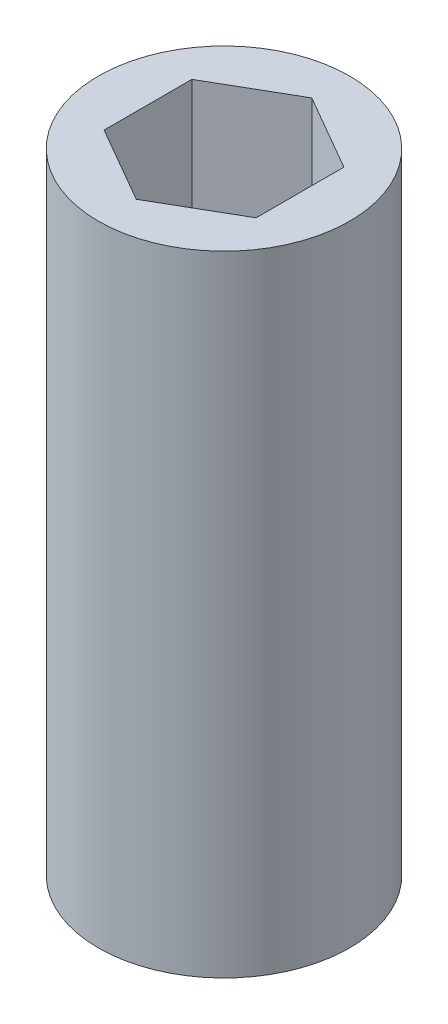
ISO-10303-21;
HEADER;
FILE_DESCRIPTION(('STEP AP214'),'2;1');
FILE_NAME('part.step','',(''),(''),'','','');
FILE_SCHEMA(('AUTOMOTIVE_DESIGN { 1 0 10303 214 1 1 1 1 }'));
ENDSEC;
DATA;
#1=APPLICATION_CONTEXT('core data for automotive mechanical design processes');
#2=APPLICATION_PROTOCOL_DEFINITION('international standard','automotive_design',2000,#1);
#3=PRODUCT_CONTEXT('',#1,'mechanical');
#4=PRODUCT('Part','Part','',(#3));
#5=PRODUCT_RELATED_PRODUCT_CATEGORY('part','',(#4));
#6=PRODUCT_DEFINITION_FORMATION('','',#4);
#7=PRODUCT_DEFINITION_CONTEXT('part definition',#1,'design');
#8=PRODUCT_DEFINITION('design','',#6,#7);
#9=PRODUCT_DEFINITION_SHAPE('','',#8);
#10=(LENGTH_UNIT() NAMED_UNIT(*) SI_UNIT(.MILLI.,.METRE.));
#11=(NAMED_UNIT(*) PLANE_ANGLE_UNIT() SI_UNIT($,.RADIAN.));
#12=(NAMED_UNIT(*) SI_UNIT($,.STERADIAN.) SOLID_ANGLE_UNIT());
#13=UNCERTAINTY_MEASURE_WITH_UNIT(LENGTH_MEASURE(1.E-05),#10,'distance_accuracy_value','');
#14=(GEOMETRIC_REPRESENTATION_CONTEXT(3) GLOBAL_UNCERTAINTY_ASSIGNED_CONTEXT((#13)) GLOBAL_UNIT_ASSIGNED_CONTEXT((#10,
#11,#12)) REPRESENTATION_CONTEXT('',''));
#15=CARTESIAN_POINT('',(0.,0.,0.));
#16=DIRECTION('',(0.,0.,1.));
#17=DIRECTION('',(1.,0.,0.));
#18=AXIS2_PLACEMENT_3D('',#15,#16,#17);
#19=CARTESIAN_POINT('',(0.,39.751,0.));
#20=DIRECTION('',(0.,1.,0.));
#21=DIRECTION('',(0.,0.,1.));
#22=AXIS2_PLACEMENT_3D('',#19,#20,#21);
#23=PLANE('',#22);
#24=CARTESIAN_POINT('',(0.,39.751,0.));
#25=DIRECTION('',(0.,1.,0.));
#26=DIRECTION('',(0.,0.,1.));
#27=AXIS2_PLACEMENT_3D('',#24,#25,#26);
#28=CIRCLE('',#27,7.9375);
#29=CARTESIAN_POINT('',(0.,39.751,7.9375));
#30=VERTEX_POINT('',#29);
#31=EDGE_CURVE('E11',#30,#30,#28,.T.);
#32=ORIENTED_EDGE('',*,*,#31,.T.);
#33=EDGE_LOOP('',(#32));
#34=FACE_BOUND('',#33,.T.);
#35=DIRECTION('',(-0.866025403784438,0.,0.500000000000001));
#36=VECTOR('',#35,1.);
#37=CARTESIAN_POINT('',(0.,39.751,-5.54325540454343));
#38=LINE('',#37,#36);
#39=CARTESIAN_POINT('',(0.,39.751,-5.54325540454343));
#40=VERTEX_POINT('',#39);
#41=CARTESIAN_POINT('',(-4.8006,39.751,-2.7716277022717));
#42=VERTEX_POINT('',#41);
#43=EDGE_CURVE('E97',#40,#42,#38,.T.);
#44=ORIENTED_EDGE('',*,*,#43,.F.);
#45=DIRECTION('',(-0.866025403784441,0.,-0.499999999999995));
#46=VECTOR('',#45,1.);
#47=CARTESIAN_POINT('',(4.80059999999996,39.751,-2.77162770227177));
#48=LINE('',#47,#46);
#49=CARTESIAN_POINT('',(4.80059999999996,39.751,-2.77162770227177));
#50=VERTEX_POINT('',#49);
#51=EDGE_CURVE('E89',#50,#40,#48,.T.);
#52=ORIENTED_EDGE('',*,*,#51,.F.);
#53=DIRECTION('',(0.,0.,-1.));
#54=VECTOR('',#53,1.);
#55=CARTESIAN_POINT('',(4.80060000000002,39.751,2.77162770227167));
#56=LINE('',#55,#54);
#57=CARTESIAN_POINT('',(4.80060000000002,39.751,2.77162770227167));
#58=VERTEX_POINT('',#57);
#59=EDGE_CURVE('E117',#58,#50,#56,.T.);
#60=ORIENTED_EDGE('',*,*,#59,.F.);
#61=DIRECTION('',(0.866025403784434,0.,-0.500000000000007));
#62=VECTOR('',#61,1.);
#63=CARTESIAN_POINT('',(0.,39.751,5.54325540454343));
#64=LINE('',#63,#62);
#65=CARTESIAN_POINT('',(0.,39.751,5.54325540454343));
#66=VERTEX_POINT('',#65);
#67=EDGE_CURVE('E115',#66,#58,#64,.T.);
#68=ORIENTED_EDGE('',*,*,#67,.F.);
#69=DIRECTION('',(0.866025403784442,0.,0.499999999999995));
#70=VECTOR('',#69,1.);
#71=CARTESIAN_POINT('',(-4.80059999999998,39.751,2.77162770227174));
#72=LINE('',#71,#70);
#73=CARTESIAN_POINT('',(-4.80059999999998,39.751,2.77162770227174));
#74=VERTEX_POINT('',#73);
#75=EDGE_CURVE('E111',#74,#66,#72,.T.);
#76=ORIENTED_EDGE('',*,*,#75,.F.);
#77=DIRECTION('',(0.,0.,1.));
#78=VECTOR('',#77,1.);
#79=CARTESIAN_POINT('',(-4.8006,39.751,-2.7716277022717));
#80=LINE('',#79,#78);
#81=EDGE_CURVE('E109',#42,#74,#80,.T.);
#82=ORIENTED_EDGE('',*,*,#81,.F.);
#83=EDGE_LOOP('',(#44,#52,#60,#68,#76,#82));
#84=FACE_BOUND('',#83,.T.);
#85=ADVANCED_FACE('F36',(#34,#84),#23,.T.);
#86=CARTESIAN_POINT('',(0.,0.,0.));
#87=DIRECTION('',(0.,1.,0.));
#88=DIRECTION('',(0.,0.,1.));
#89=AXIS2_PLACEMENT_3D('',#86,#87,#88);
#90=PLANE('',#89);
#91=CARTESIAN_POINT('',(0.,0.,0.));
#92=DIRECTION('',(0.,1.,0.));
#93=DIRECTION('',(0.,0.,1.));
#94=AXIS2_PLACEMENT_3D('',#91,#92,#93);
#95=CIRCLE('',#94,7.9375);
#96=CARTESIAN_POINT('',(0.,0.,7.9375));
#97=VERTEX_POINT('',#96);
#98=EDGE_CURVE('E40',#97,#97,#95,.T.);
#99=ORIENTED_EDGE('',*,*,#98,.F.);
#100=EDGE_LOOP('',(#99));
#101=FACE_BOUND('',#100,.T.);
#102=DIRECTION('',(-0.866025403784441,0.,-0.499999999999995));
#103=VECTOR('',#102,1.);
#104=CARTESIAN_POINT('',(4.80059999999996,0.,-2.77162770227177));
#105=LINE('',#104,#103);
#106=CARTESIAN_POINT('',(4.80059999999996,0.,-2.77162770227177));
#107=VERTEX_POINT('',#106);
#108=CARTESIAN_POINT('',(0.,0.,-5.54325540454343));
#109=VERTEX_POINT('',#108);
#110=EDGE_CURVE('E59',#107,#109,#105,.T.);
#111=ORIENTED_EDGE('',*,*,#110,.T.);
#112=DIRECTION('',(-0.866025403784438,0.,0.500000000000001));
#113=VECTOR('',#112,1.);
#114=CARTESIAN_POINT('',(0.,0.,-5.54325540454343));
#115=LINE('',#114,#113);
#116=CARTESIAN_POINT('',(-4.8006,0.,-2.7716277022717));
#117=VERTEX_POINT('',#116);
#118=EDGE_CURVE('E104',#109,#117,#115,.T.);
#119=ORIENTED_EDGE('',*,*,#118,.T.);
#120=DIRECTION('',(0.,0.,1.));
#121=VECTOR('',#120,1.);
#122=CARTESIAN_POINT('',(-4.8006,0.,-2.7716277022717));
#123=LINE('',#122,#121);
#124=CARTESIAN_POINT('',(-4.80059999999998,0.,2.77162770227174));
#125=VERTEX_POINT('',#124);
#126=EDGE_CURVE('E121',#117,#125,#123,.T.);
#127=ORIENTED_EDGE('',*,*,#126,.T.);
#128=DIRECTION('',(0.866025403784442,0.,0.499999999999995));
#129=VECTOR('',#128,1.);
#130=CARTESIAN_POINT('',(-4.80059999999998,0.,2.77162770227174));
#131=LINE('',#130,#129);
#132=CARTESIAN_POINT('',(0.,0.,5.54325540454343));
#133=VERTEX_POINT('',#132);
#134=EDGE_CURVE('E124',#125,#133,#131,.T.);
#135=ORIENTED_EDGE('',*,*,#134,.T.);
#136=DIRECTION('',(0.866025403784434,0.,-0.500000000000007));
#137=VECTOR('',#136,1.);
#138=CARTESIAN_POINT('',(0.,0.,5.54325540454343));
#139=LINE('',#138,#137);
#140=CARTESIAN_POINT('',(4.80060000000002,0.,2.77162770227167));
#141=VERTEX_POINT('',#140);
#142=EDGE_CURVE('E127',#133,#141,#139,.T.);
#143=ORIENTED_EDGE('',*,*,#142,.T.);
#144=DIRECTION('',(0.,0.,-1.));
#145=VECTOR('',#144,1.);
#146=CARTESIAN_POINT('',(4.80060000000002,0.,2.77162770227167));
#147=LINE('',#146,#145);
#148=EDGE_CURVE('E98',#141,#107,#147,.T.);
#149=ORIENTED_EDGE('',*,*,#148,.T.);
#150=EDGE_LOOP('',(#111,#119,#127,#135,#143,#149));
#151=FACE_BOUND('',#150,.T.);
#152=ADVANCED_FACE('F144',(#101,#151),#90,.F.);
#153=CARTESIAN_POINT('',(0.,39.751,0.));
#154=DIRECTION('',(0.,-1.,0.));
#155=DIRECTION('',(0.,0.,-1.));
#156=AXIS2_PLACEMENT_3D('',#153,#154,#155);
#157=CYLINDRICAL_SURFACE('',#156,7.9375);
#158=ORIENTED_EDGE('',*,*,#31,.F.);
#159=EDGE_LOOP('',(#158));
#160=FACE_BOUND('',#159,.T.);
#161=ORIENTED_EDGE('',*,*,#98,.T.);
#162=EDGE_LOOP('',(#161));
#163=FACE_BOUND('',#162,.T.);
#164=ADVANCED_FACE('F38',(#160,#163),#157,.T.);
#165=CARTESIAN_POINT('',(4.80059999999996,39.751,-2.77162770227177));
#166=DIRECTION('',(-0.499999999999995,0.,0.866025403784441));
#167=DIRECTION('',(0.866025403784442,0.,0.499999999999995));
#168=AXIS2_PLACEMENT_3D('',#165,#166,#167);
#169=PLANE('',#168);
#170=ORIENTED_EDGE('',*,*,#110,.F.);
#171=DIRECTION('',(0.,-1.,0.));
#172=VECTOR('',#171,1.);
#173=CARTESIAN_POINT('',(4.80059999999996,39.751,-2.77162770227177));
#174=LINE('',#173,#172);
#175=EDGE_CURVE('E93',#50,#107,#174,.T.);
#176=ORIENTED_EDGE('',*,*,#175,.F.);
#177=ORIENTED_EDGE('',*,*,#51,.T.);
#178=DIRECTION('',(0.,-1.,0.));
#179=VECTOR('',#178,1.);
#180=CARTESIAN_POINT('',(0.,39.751,-5.54325540454343));
#181=LINE('',#180,#179);
#182=EDGE_CURVE('E92',#40,#109,#181,.T.);
#183=ORIENTED_EDGE('',*,*,#182,.T.);
#184=EDGE_LOOP('',(#170,#176,#177,#183));
#185=FACE_BOUND('',#184,.T.);
#186=ADVANCED_FACE('F91',(#185),#169,.T.);
#187=CARTESIAN_POINT('',(0.,39.751,-5.54325540454343));
#188=DIRECTION('',(0.500000000000001,0.,0.866025403784438));
#189=DIRECTION('',(0.866025403784438,0.,-0.500000000000001));
#190=AXIS2_PLACEMENT_3D('',#187,#188,#189);
#191=PLANE('',#190);
#192=ORIENTED_EDGE('',*,*,#118,.F.);
#193=ORIENTED_EDGE('',*,*,#182,.F.);
#194=ORIENTED_EDGE('',*,*,#43,.T.);
#195=DIRECTION('',(0.,-1.,0.));
#196=VECTOR('',#195,1.);
#197=CARTESIAN_POINT('',(-4.8006,39.751,-2.7716277022717));
#198=LINE('',#197,#196);
#199=EDGE_CURVE('E105',#42,#117,#198,.T.);
#200=ORIENTED_EDGE('',*,*,#199,.T.);
#201=EDGE_LOOP('',(#192,#193,#194,#200));
#202=FACE_BOUND('',#201,.T.);
#203=ADVANCED_FACE('F101',(#202),#191,.T.);
#204=CARTESIAN_POINT('',(-4.8006,39.751,-2.7716277022717));
#205=DIRECTION('',(1.,0.,0.));
#206=DIRECTION('',(0.,0.,-1.));
#207=AXIS2_PLACEMENT_3D('',#204,#205,#206);
#208=PLANE('',#207);
#209=ORIENTED_EDGE('',*,*,#126,.F.);
#210=ORIENTED_EDGE('',*,*,#199,.F.);
#211=ORIENTED_EDGE('',*,*,#81,.T.);
#212=DIRECTION('',(0.,-1.,0.));
#213=VECTOR('',#212,1.);
#214=CARTESIAN_POINT('',(-4.80059999999998,39.751,2.77162770227174));
#215=LINE('',#214,#213);
#216=EDGE_CURVE('E136',#74,#125,#215,.T.);
#217=ORIENTED_EDGE('',*,*,#216,.T.);
#218=EDGE_LOOP('',(#209,#210,#211,#217));
#219=FACE_BOUND('',#218,.T.);
#220=ADVANCED_FACE('F140',(#219),#208,.T.);
#221=CARTESIAN_POINT('',(-4.80059999999998,39.751,2.77162770227174));
#222=DIRECTION('',(0.499999999999995,0.,-0.866025403784442));
#223=DIRECTION('',(-0.866025403784442,0.,-0.499999999999995));
#224=AXIS2_PLACEMENT_3D('',#221,#222,#223);
#225=PLANE('',#224);
#226=ORIENTED_EDGE('',*,*,#134,.F.);
#227=ORIENTED_EDGE('',*,*,#216,.F.);
#228=ORIENTED_EDGE('',*,*,#75,.T.);
#229=DIRECTION('',(0.,-1.,0.));
#230=VECTOR('',#229,1.);
#231=CARTESIAN_POINT('',(0.,39.751,5.54325540454343));
#232=LINE('',#231,#230);
#233=EDGE_CURVE('E134',#66,#133,#232,.T.);
#234=ORIENTED_EDGE('',*,*,#233,.T.);
#235=EDGE_LOOP('',(#226,#227,#228,#234));
#236=FACE_BOUND('',#235,.T.);
#237=ADVANCED_FACE('F152',(#236),#225,.T.);
#238=CARTESIAN_POINT('',(0.,39.751,5.54325540454343));
#239=DIRECTION('',(-0.500000000000007,0.,-0.866025403784435));
#240=DIRECTION('',(-0.866025403784435,0.,0.500000000000007));
#241=AXIS2_PLACEMENT_3D('',#238,#239,#240);
#242=PLANE('',#241);
#243=ORIENTED_EDGE('',*,*,#142,.F.);
#244=ORIENTED_EDGE('',*,*,#233,.F.);
#245=ORIENTED_EDGE('',*,*,#67,.T.);
#246=DIRECTION('',(0.,-1.,0.));
#247=VECTOR('',#246,1.);
#248=CARTESIAN_POINT('',(4.80060000000002,39.751,2.77162770227167));
#249=LINE('',#248,#247);
#250=EDGE_CURVE('E51',#58,#141,#249,.T.);
#251=ORIENTED_EDGE('',*,*,#250,.T.);
#252=EDGE_LOOP('',(#243,#244,#245,#251));
#253=FACE_BOUND('',#252,.T.);
#254=ADVANCED_FACE('F150',(#253),#242,.T.);
#255=CARTESIAN_POINT('',(4.80060000000002,39.751,2.77162770227167));
#256=DIRECTION('',(-1.,0.,0.));
#257=DIRECTION('',(0.,0.,1.));
#258=AXIS2_PLACEMENT_3D('',#255,#256,#257);
#259=PLANE('',#258);
#260=ORIENTED_EDGE('',*,*,#148,.F.);
#261=ORIENTED_EDGE('',*,*,#250,.F.);
#262=ORIENTED_EDGE('',*,*,#59,.T.);
#263=ORIENTED_EDGE('',*,*,#175,.T.);
#264=EDGE_LOOP('',(#260,#261,#262,#263));
#265=FACE_BOUND('',#264,.T.);
#266=ADVANCED_FACE('F146',(#265),#259,.T.);
#267=CLOSED_SHELL('',(#85,#152,#164,#186,#203,#220,#237,#254,#266));
#268=MANIFOLD_SOLID_BREP('B2',#267);
#269=ADVANCED_BREP_SHAPE_REPRESENTATION('',(#18,#268),#14);
#270=SHAPE_DEFINITION_REPRESENTATION(#9,#269);
ENDSEC;
END-ISO-10303-21;
